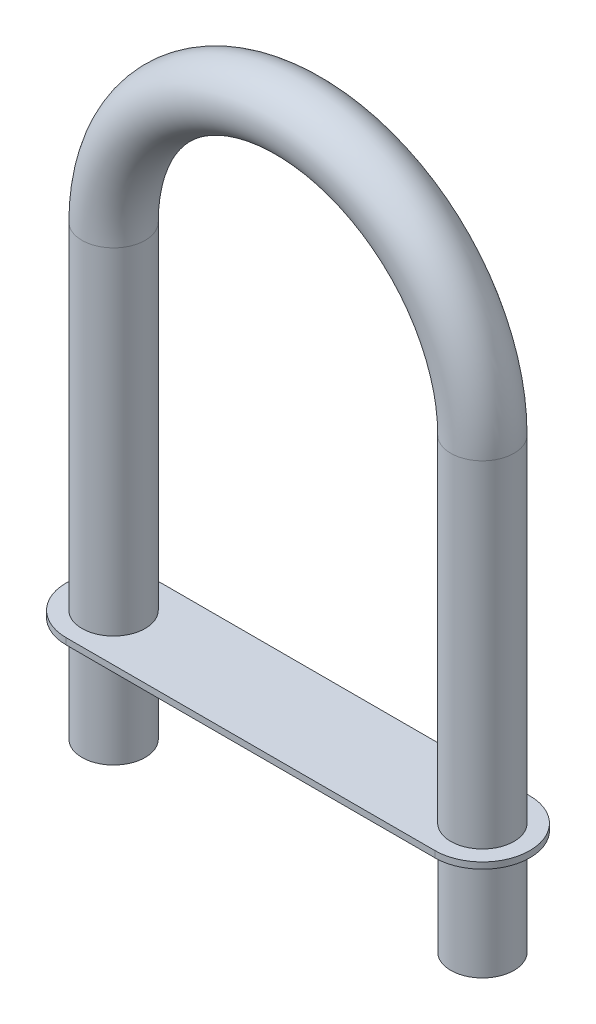
ISO-10303-21;
HEADER;
FILE_DESCRIPTION(('STEP AP214'),'2;1');
FILE_NAME('part.step','',(''),(''),'','','');
FILE_SCHEMA(('AUTOMOTIVE_DESIGN { 1 0 10303 214 1 1 1 1 }'));
ENDSEC;
DATA;
#1=APPLICATION_CONTEXT('core data for automotive mechanical design processes');
#2=APPLICATION_PROTOCOL_DEFINITION('international standard','automotive_design',2000,#1);
#3=PRODUCT_CONTEXT('',#1,'mechanical');
#4=PRODUCT('Part','Part','',(#3));
#5=PRODUCT_RELATED_PRODUCT_CATEGORY('part','',(#4));
#6=PRODUCT_DEFINITION_FORMATION('','',#4);
#7=PRODUCT_DEFINITION_CONTEXT('part definition',#1,'design');
#8=PRODUCT_DEFINITION('design','',#6,#7);
#9=PRODUCT_DEFINITION_SHAPE('','',#8);
#10=(LENGTH_UNIT() NAMED_UNIT(*) SI_UNIT(.MILLI.,.METRE.));
#11=(NAMED_UNIT(*) PLANE_ANGLE_UNIT() SI_UNIT($,.RADIAN.));
#12=(NAMED_UNIT(*) SI_UNIT($,.STERADIAN.) SOLID_ANGLE_UNIT());
#13=UNCERTAINTY_MEASURE_WITH_UNIT(LENGTH_MEASURE(1.E-05),#10,'distance_accuracy_value','');
#14=(GEOMETRIC_REPRESENTATION_CONTEXT(3) GLOBAL_UNCERTAINTY_ASSIGNED_CONTEXT((#13)) GLOBAL_UNIT_ASSIGNED_CONTEXT((#10,
#11,#12)) REPRESENTATION_CONTEXT('',''));
#15=CARTESIAN_POINT('',(0.,0.,0.));
#16=DIRECTION('',(0.,0.,1.));
#17=DIRECTION('',(1.,0.,0.));
#18=AXIS2_PLACEMENT_3D('',#15,#16,#17);
#19=CARTESIAN_POINT('',(-17.5,0.,0.));
#20=DIRECTION('',(0.,1.,0.));
#21=DIRECTION('',(-1.,0.,0.));
#22=AXIS2_PLACEMENT_3D('',#19,#20,#21);
#23=CYLINDRICAL_SURFACE('',#22,3.);
#24=CARTESIAN_POINT('',(-17.5,0.,0.));
#25=DIRECTION('',(0.,1.,0.));
#26=DIRECTION('',(0.,0.,1.));
#27=AXIS2_PLACEMENT_3D('',#24,#25,#26);
#28=CIRCLE('',#27,3.);
#29=CARTESIAN_POINT('',(-17.5,0.,3.));
#30=VERTEX_POINT('',#29);
#31=EDGE_CURVE('E144',#30,#30,#28,.T.);
#32=ORIENTED_EDGE('',*,*,#31,.T.);
#33=EDGE_LOOP('',(#32));
#34=FACE_BOUND('',#33,.T.);
#35=CARTESIAN_POINT('',(-17.5,10.,0.));
#36=DIRECTION('',(0.,1.,0.));
#37=DIRECTION('',(0.,0.,1.));
#38=AXIS2_PLACEMENT_3D('',#35,#36,#37);
#39=CIRCLE('',#38,3.);
#40=CARTESIAN_POINT('',(-17.5,10.,3.));
#41=VERTEX_POINT('',#40);
#42=EDGE_CURVE('E141',#41,#41,#39,.F.);
#43=ORIENTED_EDGE('',*,*,#42,.T.);
#44=EDGE_LOOP('',(#43));
#45=FACE_BOUND('',#44,.T.);
#46=ADVANCED_FACE('F49',(#34,#45),#23,.T.);
#47=CARTESIAN_POINT('',(-17.5,0.,0.));
#48=DIRECTION('',(0.,1.,0.));
#49=DIRECTION('',(0.,0.,1.));
#50=AXIS2_PLACEMENT_3D('',#47,#48,#49);
#51=PLANE('',#50);
#52=ORIENTED_EDGE('',*,*,#31,.F.);
#53=EDGE_LOOP('',(#52));
#54=FACE_BOUND('',#53,.T.);
#55=ADVANCED_FACE('F51',(#54),#51,.F.);
#56=CARTESIAN_POINT('',(-17.5,10.6,0.));
#57=DIRECTION('',(0.,-1.,0.));
#58=DIRECTION('',(0.,0.,-1.));
#59=AXIS2_PLACEMENT_3D('',#56,#57,#58);
#60=CYLINDRICAL_SURFACE('',#59,4.5);
#61=CARTESIAN_POINT('',(-17.5,10.,0.));
#62=DIRECTION('',(0.,1.,0.));
#63=DIRECTION('',(0.,0.,1.));
#64=AXIS2_PLACEMENT_3D('',#61,#62,#63);
#65=CIRCLE('',#64,4.5);
#66=CARTESIAN_POINT('',(-17.5,10.,-4.5));
#67=VERTEX_POINT('',#66);
#68=CARTESIAN_POINT('',(-17.5,10.,4.5));
#69=VERTEX_POINT('',#68);
#70=EDGE_CURVE('E124',#67,#69,#65,.T.);
#71=ORIENTED_EDGE('',*,*,#70,.T.);
#72=DIRECTION('',(0.,-1.,0.));
#73=VECTOR('',#72,1.);
#74=CARTESIAN_POINT('',(-17.5,10.6,4.5));
#75=LINE('',#74,#73);
#76=CARTESIAN_POINT('',(-17.5,10.6,4.5));
#77=VERTEX_POINT('',#76);
#78=EDGE_CURVE('E112',#77,#69,#75,.T.);
#79=ORIENTED_EDGE('',*,*,#78,.F.);
#80=CARTESIAN_POINT('',(-17.5,10.6,0.));
#81=DIRECTION('',(0.,1.,0.));
#82=DIRECTION('',(0.,0.,1.));
#83=AXIS2_PLACEMENT_3D('',#80,#81,#82);
#84=CIRCLE('',#83,4.5);
#85=CARTESIAN_POINT('',(-17.5,10.6,-4.5));
#86=VERTEX_POINT('',#85);
#87=EDGE_CURVE('E104',#86,#77,#84,.T.);
#88=ORIENTED_EDGE('',*,*,#87,.F.);
#89=DIRECTION('',(0.,-1.,0.));
#90=VECTOR('',#89,1.);
#91=CARTESIAN_POINT('',(-17.5,10.6,-4.5));
#92=LINE('',#91,#90);
#93=EDGE_CURVE('E120',#86,#67,#92,.T.);
#94=ORIENTED_EDGE('',*,*,#93,.T.);
#95=EDGE_LOOP('',(#71,#79,#88,#94));
#96=FACE_BOUND('',#95,.T.);
#97=ADVANCED_FACE('F175',(#96),#60,.T.);
#98=CARTESIAN_POINT('',(-17.5,10.6,4.5));
#99=DIRECTION('',(0.,0.,-1.));
#100=DIRECTION('',(-1.,0.,0.));
#101=AXIS2_PLACEMENT_3D('',#98,#99,#100);
#102=PLANE('',#101);
#103=DIRECTION('',(1.,0.,0.));
#104=VECTOR('',#103,1.);
#105=CARTESIAN_POINT('',(-17.5,10.,4.5));
#106=LINE('',#105,#104);
#107=CARTESIAN_POINT('',(17.5,10.,4.5));
#108=VERTEX_POINT('',#107);
#109=EDGE_CURVE('E110',#69,#108,#106,.T.);
#110=ORIENTED_EDGE('',*,*,#109,.T.);
#111=DIRECTION('',(0.,-1.,0.));
#112=VECTOR('',#111,1.);
#113=CARTESIAN_POINT('',(17.5,10.6,4.5));
#114=LINE('',#113,#112);
#115=CARTESIAN_POINT('',(17.5,10.6,4.5));
#116=VERTEX_POINT('',#115);
#117=EDGE_CURVE('E108',#116,#108,#114,.T.);
#118=ORIENTED_EDGE('',*,*,#117,.F.);
#119=DIRECTION('',(1.,0.,0.));
#120=VECTOR('',#119,1.);
#121=CARTESIAN_POINT('',(-17.5,10.6,4.5));
#122=LINE('',#121,#120);
#123=EDGE_CURVE('E99',#77,#116,#122,.T.);
#124=ORIENTED_EDGE('',*,*,#123,.F.);
#125=ORIENTED_EDGE('',*,*,#78,.T.);
#126=EDGE_LOOP('',(#110,#118,#124,#125));
#127=FACE_BOUND('',#126,.T.);
#128=ADVANCED_FACE('F109',(#127),#102,.F.);
#129=CARTESIAN_POINT('',(17.5,10.6,0.));
#130=DIRECTION('',(0.,-1.,0.));
#131=DIRECTION('',(0.,0.,-1.));
#132=AXIS2_PLACEMENT_3D('',#129,#130,#131);
#133=CYLINDRICAL_SURFACE('',#132,4.5);
#134=CARTESIAN_POINT('',(17.5,10.,0.));
#135=DIRECTION('',(0.,1.,0.));
#136=DIRECTION('',(0.,0.,1.));
#137=AXIS2_PLACEMENT_3D('',#134,#135,#136);
#138=CIRCLE('',#137,4.5);
#139=CARTESIAN_POINT('',(17.5,10.,-4.5));
#140=VERTEX_POINT('',#139);
#141=EDGE_CURVE('E85',#108,#140,#138,.T.);
#142=ORIENTED_EDGE('',*,*,#141,.T.);
#143=DIRECTION('',(0.,-1.,0.));
#144=VECTOR('',#143,1.);
#145=CARTESIAN_POINT('',(17.5,10.6,-4.5));
#146=LINE('',#145,#144);
#147=CARTESIAN_POINT('',(17.5,10.6,-4.5));
#148=VERTEX_POINT('',#147);
#149=EDGE_CURVE('E113',#148,#140,#146,.T.);
#150=ORIENTED_EDGE('',*,*,#149,.F.);
#151=CARTESIAN_POINT('',(17.5,10.6,0.));
#152=DIRECTION('',(0.,1.,0.));
#153=DIRECTION('',(0.,0.,1.));
#154=AXIS2_PLACEMENT_3D('',#151,#152,#153);
#155=CIRCLE('',#154,4.5);
#156=EDGE_CURVE('E102',#116,#148,#155,.T.);
#157=ORIENTED_EDGE('',*,*,#156,.F.);
#158=ORIENTED_EDGE('',*,*,#117,.T.);
#159=EDGE_LOOP('',(#142,#150,#157,#158));
#160=FACE_BOUND('',#159,.T.);
#161=ADVANCED_FACE('F115',(#160),#133,.T.);
#162=CARTESIAN_POINT('',(-17.5,10.6,-4.5));
#163=DIRECTION('',(0.,0.,1.));
#164=DIRECTION('',(1.,0.,0.));
#165=AXIS2_PLACEMENT_3D('',#162,#163,#164);
#166=PLANE('',#165);
#167=DIRECTION('',(-1.,0.,0.));
#168=VECTOR('',#167,1.);
#169=CARTESIAN_POINT('',(-17.5,10.,-4.5));
#170=LINE('',#169,#168);
#171=EDGE_CURVE('E91',#140,#67,#170,.T.);
#172=ORIENTED_EDGE('',*,*,#171,.T.);
#173=ORIENTED_EDGE('',*,*,#93,.F.);
#174=DIRECTION('',(-1.,0.,0.));
#175=VECTOR('',#174,1.);
#176=CARTESIAN_POINT('',(-17.5,10.6,-4.5));
#177=LINE('',#176,#175);
#178=EDGE_CURVE('E68',#148,#86,#177,.T.);
#179=ORIENTED_EDGE('',*,*,#178,.F.);
#180=ORIENTED_EDGE('',*,*,#149,.T.);
#181=EDGE_LOOP('',(#172,#173,#179,#180));
#182=FACE_BOUND('',#181,.T.);
#183=ADVANCED_FACE('F176',(#182),#166,.F.);
#184=CARTESIAN_POINT('',(-17.5,10.6,0.));
#185=DIRECTION('',(0.,1.,0.));
#186=DIRECTION('',(0.,0.,1.));
#187=AXIS2_PLACEMENT_3D('',#184,#185,#186);
#188=PLANE('',#187);
#189=CARTESIAN_POINT('',(-17.5,10.6,0.));
#190=DIRECTION('',(0.,1.,0.));
#191=DIRECTION('',(0.,0.,1.));
#192=AXIS2_PLACEMENT_3D('',#189,#190,#191);
#193=CIRCLE('',#192,3.);
#194=CARTESIAN_POINT('',(-17.5,10.6,3.));
#195=VERTEX_POINT('',#194);
#196=EDGE_CURVE('E11',#195,#195,#193,.F.);
#197=ORIENTED_EDGE('',*,*,#196,.T.);
#198=EDGE_LOOP('',(#197));
#199=FACE_BOUND('',#198,.T.);
#200=CARTESIAN_POINT('',(17.5,10.6,0.));
#201=DIRECTION('',(0.,1.,0.));
#202=DIRECTION('',(0.,0.,1.));
#203=AXIS2_PLACEMENT_3D('',#200,#201,#202);
#204=CIRCLE('',#203,3.);
#205=CARTESIAN_POINT('',(17.5,10.6,3.));
#206=VERTEX_POINT('',#205);
#207=EDGE_CURVE('E53',#206,#206,#204,.F.);
#208=ORIENTED_EDGE('',*,*,#207,.T.);
#209=EDGE_LOOP('',(#208));
#210=FACE_BOUND('',#209,.T.);
#211=ORIENTED_EDGE('',*,*,#87,.T.);
#212=ORIENTED_EDGE('',*,*,#123,.T.);
#213=ORIENTED_EDGE('',*,*,#156,.T.);
#214=ORIENTED_EDGE('',*,*,#178,.T.);
#215=EDGE_LOOP('',(#211,#212,#213,#214));
#216=FACE_BOUND('',#215,.T.);
#217=ADVANCED_FACE('F100',(#199,#210,#216),#188,.T.);
#218=CARTESIAN_POINT('',(-17.5,10.,0.));
#219=DIRECTION('',(0.,1.,0.));
#220=DIRECTION('',(0.,0.,1.));
#221=AXIS2_PLACEMENT_3D('',#218,#219,#220);
#222=PLANE('',#221);
#223=ORIENTED_EDGE('',*,*,#42,.F.);
#224=EDGE_LOOP('',(#223));
#225=FACE_BOUND('',#224,.T.);
#226=CARTESIAN_POINT('',(17.5,10.,0.));
#227=DIRECTION('',(0.,1.,0.));
#228=DIRECTION('',(0.,0.,1.));
#229=AXIS2_PLACEMENT_3D('',#226,#227,#228);
#230=CIRCLE('',#229,3.);
#231=CARTESIAN_POINT('',(17.5,10.,3.));
#232=VERTEX_POINT('',#231);
#233=EDGE_CURVE('E140',#232,#232,#230,.F.);
#234=ORIENTED_EDGE('',*,*,#233,.F.);
#235=EDGE_LOOP('',(#234));
#236=FACE_BOUND('',#235,.T.);
#237=ORIENTED_EDGE('',*,*,#70,.F.);
#238=ORIENTED_EDGE('',*,*,#171,.F.);
#239=ORIENTED_EDGE('',*,*,#141,.F.);
#240=ORIENTED_EDGE('',*,*,#109,.F.);
#241=EDGE_LOOP('',(#237,#238,#239,#240));
#242=FACE_BOUND('',#241,.T.);
#243=ADVANCED_FACE('F167',(#225,#236,#242),#222,.F.);
#244=ORIENTED_EDGE('',*,*,#196,.F.);
#245=EDGE_LOOP('',(#244));
#246=FACE_BOUND('',#245,.T.);
#247=CARTESIAN_POINT('',(-17.5,42.5,0.));
#248=DIRECTION('',(0.,1.,0.));
#249=DIRECTION('',(0.,0.,1.));
#250=AXIS2_PLACEMENT_3D('',#247,#248,#249);
#251=CIRCLE('',#250,3.);
#252=CARTESIAN_POINT('',(-20.5,42.5,0.));
#253=VERTEX_POINT('',#252);
#254=EDGE_CURVE('E149',#253,#253,#251,.T.);
#255=ORIENTED_EDGE('',*,*,#254,.F.);
#256=EDGE_LOOP('',(#255));
#257=FACE_BOUND('',#256,.T.);
#258=ADVANCED_FACE('F170',(#246,#257),#23,.T.);
#259=CARTESIAN_POINT('',(0.,42.5,0.));
#260=DIRECTION('',(0.,0.,-1.));
#261=DIRECTION('',(-1.,0.,0.));
#262=AXIS2_PLACEMENT_3D('',#259,#260,#261);
#263=TOROIDAL_SURFACE('',#262,17.5,3.);
#264=CARTESIAN_POINT('',(17.5,42.5,0.));
#265=DIRECTION('',(0.,-1.,0.));
#266=DIRECTION('',(0.,0.,1.));
#267=AXIS2_PLACEMENT_3D('',#264,#265,#266);
#268=CIRCLE('',#267,3.);
#269=CARTESIAN_POINT('',(20.5,42.5,0.));
#270=VERTEX_POINT('',#269);
#271=EDGE_CURVE('E153',#270,#270,#268,.T.);
#272=CARTESIAN_POINT('',(0.,42.5,0.));
#273=DIRECTION('',(0.,0.,-1.));
#274=DIRECTION('',(-1.,0.,0.));
#275=AXIS2_PLACEMENT_3D('',#272,#273,#274);
#276=CIRCLE('',#275,20.5);
#277=EDGE_CURVE('',#253,#270,#276,.T.);
#278=ORIENTED_EDGE('',*,*,#254,.T.);
#279=ORIENTED_EDGE('',*,*,#271,.F.);
#280=ORIENTED_EDGE('',*,*,#277,.T.);
#281=ORIENTED_EDGE('',*,*,#277,.F.);
#282=EDGE_LOOP('',(#278,#280,#279,#281));
#283=FACE_BOUND('',#282,.T.);
#284=ADVANCED_FACE('F197',(#283),#263,.T.);
#285=CARTESIAN_POINT('',(17.5,42.5,0.));
#286=DIRECTION('',(0.,-1.,0.));
#287=DIRECTION('',(1.,0.,0.));
#288=AXIS2_PLACEMENT_3D('',#285,#286,#287);
#289=CYLINDRICAL_SURFACE('',#288,3.);
#290=ORIENTED_EDGE('',*,*,#207,.F.);
#291=EDGE_LOOP('',(#290));
#292=FACE_BOUND('',#291,.T.);
#293=ORIENTED_EDGE('',*,*,#271,.T.);
#294=EDGE_LOOP('',(#293));
#295=FACE_BOUND('',#294,.T.);
#296=ADVANCED_FACE('F202',(#292,#295),#289,.T.);
#297=CARTESIAN_POINT('',(17.5,0.,0.));
#298=DIRECTION('',(0.,-1.,0.));
#299=DIRECTION('',(0.,0.,1.));
#300=AXIS2_PLACEMENT_3D('',#297,#298,#299);
#301=PLANE('',#300);
#302=CARTESIAN_POINT('',(17.5,0.,0.));
#303=DIRECTION('',(0.,-1.,0.));
#304=DIRECTION('',(0.,0.,1.));
#305=AXIS2_PLACEMENT_3D('',#302,#303,#304);
#306=CIRCLE('',#305,3.);
#307=CARTESIAN_POINT('',(17.5,0.,3.));
#308=VERTEX_POINT('',#307);
#309=EDGE_CURVE('E157',#308,#308,#306,.T.);
#310=ORIENTED_EDGE('',*,*,#309,.T.);
#311=EDGE_LOOP('',(#310));
#312=FACE_BOUND('',#311,.T.);
#313=ADVANCED_FACE('F222',(#312),#301,.T.);
#314=ORIENTED_EDGE('',*,*,#309,.F.);
#315=EDGE_LOOP('',(#314));
#316=FACE_BOUND('',#315,.T.);
#317=ORIENTED_EDGE('',*,*,#233,.T.);
#318=EDGE_LOOP('',(#317));
#319=FACE_BOUND('',#318,.T.);
#320=ADVANCED_FACE('F165',(#316,#319),#289,.T.);
#321=CLOSED_SHELL('',(#46,#55,#97,#128,#161,#183,#217,#243,#258,#284,#296,#313,#320));
#322=MANIFOLD_SOLID_BREP('B2',#321);
#323=ADVANCED_BREP_SHAPE_REPRESENTATION('',(#18,#322),#14);
#324=SHAPE_DEFINITION_REPRESENTATION(#9,#323);
ENDSEC;
END-ISO-10303-21;
